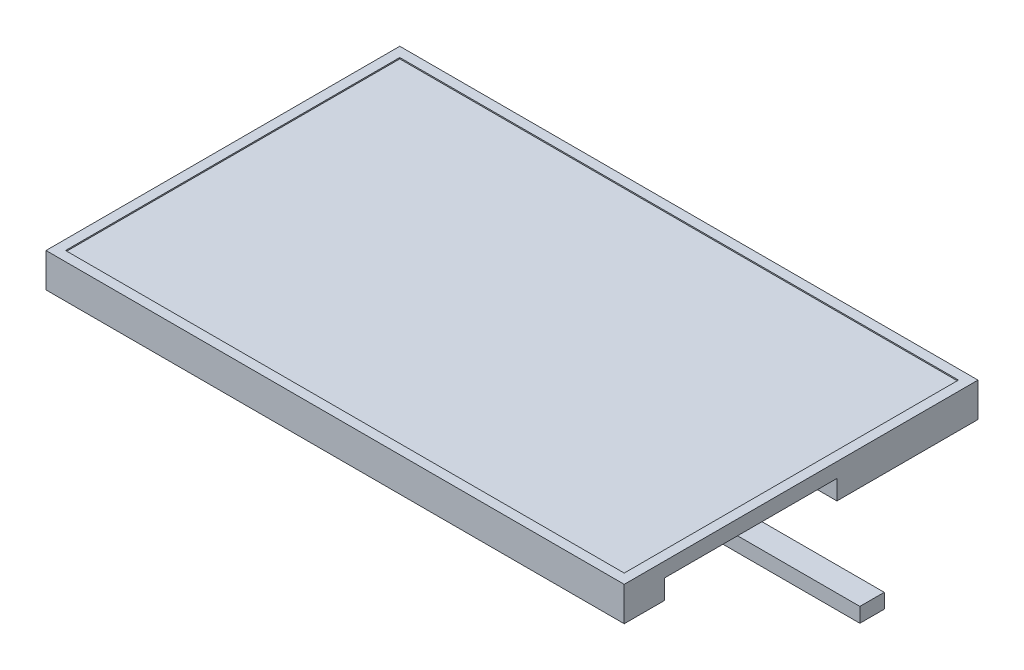
ISO-10303-21;
HEADER;
FILE_DESCRIPTION(('STEP AP214'),'2;1');
FILE_NAME('part.step','',(''),(''),'','','');
FILE_SCHEMA(('AUTOMOTIVE_DESIGN { 1 0 10303 214 1 1 1 1 }'));
ENDSEC;
DATA;
#1=APPLICATION_CONTEXT('core data for automotive mechanical design processes');
#2=APPLICATION_PROTOCOL_DEFINITION('international standard','automotive_design',2000,#1);
#3=PRODUCT_CONTEXT('',#1,'mechanical');
#4=PRODUCT('Part','Part','',(#3));
#5=PRODUCT_RELATED_PRODUCT_CATEGORY('part','',(#4));
#6=PRODUCT_DEFINITION_FORMATION('','',#4);
#7=PRODUCT_DEFINITION_CONTEXT('part definition',#1,'design');
#8=PRODUCT_DEFINITION('design','',#6,#7);
#9=PRODUCT_DEFINITION_SHAPE('','',#8);
#10=(LENGTH_UNIT() NAMED_UNIT(*) SI_UNIT(.MILLI.,.METRE.));
#11=(NAMED_UNIT(*) PLANE_ANGLE_UNIT() SI_UNIT($,.RADIAN.));
#12=(NAMED_UNIT(*) SI_UNIT($,.STERADIAN.) SOLID_ANGLE_UNIT());
#13=UNCERTAINTY_MEASURE_WITH_UNIT(LENGTH_MEASURE(1.E-05),#10,'distance_accuracy_value','');
#14=(GEOMETRIC_REPRESENTATION_CONTEXT(3) GLOBAL_UNCERTAINTY_ASSIGNED_CONTEXT((#13)) GLOBAL_UNIT_ASSIGNED_CONTEXT((#10,
#11,#12)) REPRESENTATION_CONTEXT('',''));
#15=CARTESIAN_POINT('',(0.,0.,0.));
#16=DIRECTION('',(0.,0.,1.));
#17=DIRECTION('',(1.,0.,0.));
#18=AXIS2_PLACEMENT_3D('',#15,#16,#17);
#19=CARTESIAN_POINT('',(86.6232743335084,8.,-87.1819107574992));
#20=DIRECTION('',(-1.,0.,0.));
#21=DIRECTION('',(0.,0.,1.));
#22=AXIS2_PLACEMENT_3D('',#19,#20,#21);
#23=PLANE('',#22);
#24=DIRECTION('',(0.,-1.,0.));
#25=VECTOR('',#24,1.);
#26=CARTESIAN_POINT('',(86.6232743335084,6.,-48.4583257592134));
#27=LINE('',#26,#25);
#28=CARTESIAN_POINT('',(86.6232743335084,6.,-48.4583257592134));
#29=VERTEX_POINT('',#28);
#30=CARTESIAN_POINT('',(86.6232743335084,0.,-48.4583257592134));
#31=VERTEX_POINT('',#30);
#32=EDGE_CURVE('E184',#29,#31,#27,.T.);
#33=ORIENTED_EDGE('',*,*,#32,.F.);
#34=DIRECTION('',(0.,0.,1.));
#35=VECTOR('',#34,1.);
#36=CARTESIAN_POINT('',(86.6232743335084,6.,-48.4583257592134));
#37=LINE('',#36,#35);
#38=CARTESIAN_POINT('',(86.6232743335084,6.,-58.4583257592134));
#39=VERTEX_POINT('',#38);
#40=EDGE_CURVE('E64',#39,#29,#37,.T.);
#41=ORIENTED_EDGE('',*,*,#40,.F.);
#42=DIRECTION('',(0.,1.,0.));
#43=VECTOR('',#42,1.);
#44=CARTESIAN_POINT('',(86.6232743335084,6.,-58.4583257592134));
#45=LINE('',#44,#43);
#46=CARTESIAN_POINT('',(86.6232743335084,0.,-58.4583257592134));
#47=VERTEX_POINT('',#46);
#48=EDGE_CURVE('E68',#47,#39,#45,.T.);
#49=ORIENTED_EDGE('',*,*,#48,.F.);
#50=DIRECTION('',(0.,0.,-1.));
#51=VECTOR('',#50,1.);
#52=CARTESIAN_POINT('',(86.6232743335084,0.,-87.1819107574992));
#53=LINE('',#52,#51);
#54=CARTESIAN_POINT('',(86.6232743335084,0.,-87.1819107574992));
#55=VERTEX_POINT('',#54);
#56=EDGE_CURVE('E239',#47,#55,#53,.T.);
#57=ORIENTED_EDGE('',*,*,#56,.T.);
#58=DIRECTION('',(0.,-1.,0.));
#59=VECTOR('',#58,1.);
#60=CARTESIAN_POINT('',(86.6232743335084,8.,-87.1819107574992));
#61=LINE('',#60,#59);
#62=CARTESIAN_POINT('',(86.6232743335084,8.,-87.1819107574992));
#63=VERTEX_POINT('',#62);
#64=EDGE_CURVE('E247',#63,#55,#61,.T.);
#65=ORIENTED_EDGE('',*,*,#64,.F.);
#66=DIRECTION('',(0.,0.,-1.));
#67=VECTOR('',#66,1.);
#68=CARTESIAN_POINT('',(86.6232743335084,8.,-87.1819107574992));
#69=LINE('',#68,#67);
#70=CARTESIAN_POINT('',(86.6232743335084,8.,-16.5110370150003));
#71=VERTEX_POINT('',#70);
#72=EDGE_CURVE('E230',#71,#63,#69,.T.);
#73=ORIENTED_EDGE('',*,*,#72,.F.);
#74=DIRECTION('',(0.,-1.,0.));
#75=VECTOR('',#74,1.);
#76=CARTESIAN_POINT('',(86.6232743335084,8.,-16.5110370150003));
#77=LINE('',#76,#75);
#78=CARTESIAN_POINT('',(86.6232743335084,0.,-16.5110370150003));
#79=VERTEX_POINT('',#78);
#80=EDGE_CURVE('E250',#71,#79,#77,.T.);
#81=ORIENTED_EDGE('',*,*,#80,.T.);
#82=EDGE_CURVE('E240',#79,#31,#53,.T.);
#83=ORIENTED_EDGE('',*,*,#82,.T.);
#84=EDGE_LOOP('',(#33,#41,#49,#57,#65,#73,#81,#83));
#85=FACE_BOUND('',#84,.T.);
#86=ADVANCED_FACE('F49',(#85),#23,.F.);
#87=CARTESIAN_POINT('',(-118.5,14.,-145.));
#88=DIRECTION('',(1.,0.,0.));
#89=DIRECTION('',(0.,0.,-1.));
#90=AXIS2_PLACEMENT_3D('',#87,#88,#89);
#91=PLANE('',#90);
#92=DIRECTION('',(0.,0.,1.));
#93=VECTOR('',#92,1.);
#94=CARTESIAN_POINT('',(-118.5,0.,-145.));
#95=LINE('',#94,#93);
#96=CARTESIAN_POINT('',(-118.5,0.,-145.));
#97=VERTEX_POINT('',#96);
#98=CARTESIAN_POINT('',(-118.5,0.,0.));
#99=VERTEX_POINT('',#98);
#100=EDGE_CURVE('E280',#97,#99,#95,.T.);
#101=ORIENTED_EDGE('',*,*,#100,.T.);
#102=DIRECTION('',(0.,-1.,0.));
#103=VECTOR('',#102,1.);
#104=CARTESIAN_POINT('',(-118.5,14.,0.));
#105=LINE('',#104,#103);
#106=CARTESIAN_POINT('',(-118.5,14.,0.));
#107=VERTEX_POINT('',#106);
#108=EDGE_CURVE('E11',#107,#99,#105,.T.);
#109=ORIENTED_EDGE('',*,*,#108,.F.);
#110=DIRECTION('',(0.,0.,1.));
#111=VECTOR('',#110,1.);
#112=CARTESIAN_POINT('',(-118.5,14.,-145.));
#113=LINE('',#112,#111);
#114=CARTESIAN_POINT('',(-118.5,14.,-145.));
#115=VERTEX_POINT('',#114);
#116=EDGE_CURVE('E283',#115,#107,#113,.T.);
#117=ORIENTED_EDGE('',*,*,#116,.F.);
#118=DIRECTION('',(0.,-1.,0.));
#119=VECTOR('',#118,1.);
#120=CARTESIAN_POINT('',(-118.5,14.,-145.));
#121=LINE('',#120,#119);
#122=EDGE_CURVE('E293',#115,#97,#121,.T.);
#123=ORIENTED_EDGE('',*,*,#122,.T.);
#124=EDGE_LOOP('',(#101,#109,#117,#123));
#125=FACE_BOUND('',#124,.T.);
#126=ADVANCED_FACE('F51',(#125),#91,.F.);
#127=CARTESIAN_POINT('',(-118.5,14.,0.));
#128=DIRECTION('',(0.,0.,-1.));
#129=DIRECTION('',(-1.,0.,0.));
#130=AXIS2_PLACEMENT_3D('',#127,#128,#129);
#131=PLANE('',#130);
#132=DIRECTION('',(1.,0.,0.));
#133=VECTOR('',#132,1.);
#134=CARTESIAN_POINT('',(-118.5,0.,0.));
#135=LINE('',#134,#133);
#136=CARTESIAN_POINT('',(118.5,0.,0.));
#137=VERTEX_POINT('',#136);
#138=EDGE_CURVE('E296',#99,#137,#135,.T.);
#139=ORIENTED_EDGE('',*,*,#138,.T.);
#140=DIRECTION('',(0.,-1.,0.));
#141=VECTOR('',#140,1.);
#142=CARTESIAN_POINT('',(118.5,14.,0.));
#143=LINE('',#142,#141);
#144=CARTESIAN_POINT('',(118.5,14.,0.));
#145=VERTEX_POINT('',#144);
#146=EDGE_CURVE('E57',#145,#137,#143,.T.);
#147=ORIENTED_EDGE('',*,*,#146,.F.);
#148=DIRECTION('',(1.,0.,0.));
#149=VECTOR('',#148,1.);
#150=CARTESIAN_POINT('',(-118.5,14.,0.));
#151=LINE('',#150,#149);
#152=EDGE_CURVE('E286',#107,#145,#151,.T.);
#153=ORIENTED_EDGE('',*,*,#152,.F.);
#154=ORIENTED_EDGE('',*,*,#108,.T.);
#155=EDGE_LOOP('',(#139,#147,#153,#154));
#156=FACE_BOUND('',#155,.T.);
#157=ADVANCED_FACE('F337',(#156),#131,.F.);
#158=CARTESIAN_POINT('',(118.5,14.,-145.));
#159=DIRECTION('',(-1.,0.,0.));
#160=DIRECTION('',(0.,0.,1.));
#161=AXIS2_PLACEMENT_3D('',#158,#159,#160);
#162=PLANE('',#161);
#163=DIRECTION('',(0.,0.,1.));
#164=VECTOR('',#163,1.);
#165=CARTESIAN_POINT('',(118.5,8.,-87.1819107574992));
#166=LINE('',#165,#164);
#167=CARTESIAN_POINT('',(118.5,8.,-87.1819107574992));
#168=VERTEX_POINT('',#167);
#169=CARTESIAN_POINT('',(118.5,8.,-16.5110370150003));
#170=VERTEX_POINT('',#169);
#171=EDGE_CURVE('E223',#168,#170,#166,.T.);
#172=ORIENTED_EDGE('',*,*,#171,.F.);
#173=DIRECTION('',(0.,-1.,0.));
#174=VECTOR('',#173,1.);
#175=CARTESIAN_POINT('',(118.5,8.,-87.1819107574992));
#176=LINE('',#175,#174);
#177=CARTESIAN_POINT('',(118.5,0.,-87.1819107574992));
#178=VERTEX_POINT('',#177);
#179=EDGE_CURVE('E243',#168,#178,#176,.T.);
#180=ORIENTED_EDGE('',*,*,#179,.T.);
#181=DIRECTION('',(0.,0.,-1.));
#182=VECTOR('',#181,1.);
#183=CARTESIAN_POINT('',(118.5,0.,-145.));
#184=LINE('',#183,#182);
#185=CARTESIAN_POINT('',(118.5,0.,-145.));
#186=VERTEX_POINT('',#185);
#187=EDGE_CURVE('E298',#178,#186,#184,.T.);
#188=ORIENTED_EDGE('',*,*,#187,.T.);
#189=DIRECTION('',(0.,-1.,0.));
#190=VECTOR('',#189,1.);
#191=CARTESIAN_POINT('',(118.5,14.,-145.));
#192=LINE('',#191,#190);
#193=CARTESIAN_POINT('',(118.5,14.,-145.));
#194=VERTEX_POINT('',#193);
#195=EDGE_CURVE('E305',#194,#186,#192,.T.);
#196=ORIENTED_EDGE('',*,*,#195,.F.);
#197=DIRECTION('',(0.,0.,-1.));
#198=VECTOR('',#197,1.);
#199=CARTESIAN_POINT('',(118.5,14.,-145.));
#200=LINE('',#199,#198);
#201=EDGE_CURVE('E289',#145,#194,#200,.T.);
#202=ORIENTED_EDGE('',*,*,#201,.F.);
#203=ORIENTED_EDGE('',*,*,#146,.T.);
#204=CARTESIAN_POINT('',(118.5,0.,-16.5110370150003));
#205=VERTEX_POINT('',#204);
#206=EDGE_CURVE('E299',#137,#205,#184,.T.);
#207=ORIENTED_EDGE('',*,*,#206,.T.);
#208=DIRECTION('',(0.,-1.,0.));
#209=VECTOR('',#208,1.);
#210=CARTESIAN_POINT('',(118.5,8.,-16.5110370150003));
#211=LINE('',#210,#209);
#212=EDGE_CURVE('E236',#170,#205,#211,.T.);
#213=ORIENTED_EDGE('',*,*,#212,.F.);
#214=EDGE_LOOP('',(#172,#180,#188,#196,#202,#203,#207,#213));
#215=FACE_BOUND('',#214,.T.);
#216=ADVANCED_FACE('F313',(#215),#162,.F.);
#217=CARTESIAN_POINT('',(-118.5,14.,-145.));
#218=DIRECTION('',(0.,0.,1.));
#219=DIRECTION('',(1.,0.,0.));
#220=AXIS2_PLACEMENT_3D('',#217,#218,#219);
#221=PLANE('',#220);
#222=DIRECTION('',(-1.,0.,0.));
#223=VECTOR('',#222,1.);
#224=CARTESIAN_POINT('',(-118.5,0.,-145.));
#225=LINE('',#224,#223);
#226=EDGE_CURVE('E287',#186,#97,#225,.T.);
#227=ORIENTED_EDGE('',*,*,#226,.T.);
#228=ORIENTED_EDGE('',*,*,#122,.F.);
#229=DIRECTION('',(-1.,0.,0.));
#230=VECTOR('',#229,1.);
#231=CARTESIAN_POINT('',(-118.5,14.,-145.));
#232=LINE('',#231,#230);
#233=EDGE_CURVE('E291',#194,#115,#232,.T.);
#234=ORIENTED_EDGE('',*,*,#233,.F.);
#235=ORIENTED_EDGE('',*,*,#195,.T.);
#236=EDGE_LOOP('',(#227,#228,#234,#235));
#237=FACE_BOUND('',#236,.T.);
#238=ADVANCED_FACE('F331',(#237),#221,.F.);
#239=CARTESIAN_POINT('',(0.,14.,0.));
#240=DIRECTION('',(0.,1.,0.));
#241=DIRECTION('',(0.,0.,1.));
#242=AXIS2_PLACEMENT_3D('',#239,#240,#241);
#243=PLANE('',#242);
#244=DIRECTION('',(-1.,0.,0.));
#245=VECTOR('',#244,1.);
#246=CARTESIAN_POINT('',(114.5,14.,-141.));
#247=LINE('',#246,#245);
#248=CARTESIAN_POINT('',(114.5,14.,-141.));
#249=VERTEX_POINT('',#248);
#250=CARTESIAN_POINT('',(-114.5,14.,-141.));
#251=VERTEX_POINT('',#250);
#252=EDGE_CURVE('E185',#249,#251,#247,.T.);
#253=ORIENTED_EDGE('',*,*,#252,.F.);
#254=DIRECTION('',(0.,0.,-1.));
#255=VECTOR('',#254,1.);
#256=CARTESIAN_POINT('',(114.5,14.,-4.00000000000004));
#257=LINE('',#256,#255);
#258=CARTESIAN_POINT('',(114.5,14.,-4.00000000000004));
#259=VERTEX_POINT('',#258);
#260=EDGE_CURVE('E197',#259,#249,#257,.T.);
#261=ORIENTED_EDGE('',*,*,#260,.F.);
#262=DIRECTION('',(1.,0.,0.));
#263=VECTOR('',#262,1.);
#264=CARTESIAN_POINT('',(-114.5,14.,-4.));
#265=LINE('',#264,#263);
#266=CARTESIAN_POINT('',(-114.5,14.,-4.));
#267=VERTEX_POINT('',#266);
#268=EDGE_CURVE('E209',#267,#259,#265,.T.);
#269=ORIENTED_EDGE('',*,*,#268,.F.);
#270=DIRECTION('',(0.,0.,1.));
#271=VECTOR('',#270,1.);
#272=CARTESIAN_POINT('',(-114.5,14.,-141.));
#273=LINE('',#272,#271);
#274=EDGE_CURVE('E187',#251,#267,#273,.T.);
#275=ORIENTED_EDGE('',*,*,#274,.F.);
#276=EDGE_LOOP('',(#253,#261,#269,#275));
#277=FACE_BOUND('',#276,.T.);
#278=ORIENTED_EDGE('',*,*,#116,.T.);
#279=ORIENTED_EDGE('',*,*,#152,.T.);
#280=ORIENTED_EDGE('',*,*,#201,.T.);
#281=ORIENTED_EDGE('',*,*,#233,.T.);
#282=EDGE_LOOP('',(#278,#279,#280,#281));
#283=FACE_BOUND('',#282,.T.);
#284=ADVANCED_FACE('F335',(#277,#283),#243,.T.);
#285=CARTESIAN_POINT('',(0.,0.,0.));
#286=DIRECTION('',(0.,1.,0.));
#287=DIRECTION('',(0.,0.,1.));
#288=AXIS2_PLACEMENT_3D('',#285,#286,#287);
#289=PLANE('',#288);
#290=CARTESIAN_POINT('',(0.,0.,-24.));
#291=DIRECTION('',(0.,-1.,0.));
#292=DIRECTION('',(0.,0.,-1.));
#293=AXIS2_PLACEMENT_3D('',#290,#291,#292);
#294=CIRCLE('',#293,3.);
#295=CARTESIAN_POINT('',(0.,0.,-27.));
#296=VERTEX_POINT('',#295);
#297=EDGE_CURVE('E272',#296,#296,#294,.T.);
#298=ORIENTED_EDGE('',*,*,#297,.F.);
#299=EDGE_LOOP('',(#298));
#300=FACE_BOUND('',#299,.T.);
#301=CARTESIAN_POINT('',(37.5,0.,-35.));
#302=DIRECTION('',(0.,-1.,0.));
#303=DIRECTION('',(0.,0.,-1.));
#304=AXIS2_PLACEMENT_3D('',#301,#302,#303);
#305=CIRCLE('',#304,2.);
#306=CARTESIAN_POINT('',(37.5,0.,-37.));
#307=VERTEX_POINT('',#306);
#308=EDGE_CURVE('E266',#307,#307,#305,.T.);
#309=ORIENTED_EDGE('',*,*,#308,.F.);
#310=EDGE_LOOP('',(#309));
#311=FACE_BOUND('',#310,.T.);
#312=CARTESIAN_POINT('',(-37.5,0.,-35.));
#313=DIRECTION('',(0.,-1.,0.));
#314=DIRECTION('',(0.,0.,-1.));
#315=AXIS2_PLACEMENT_3D('',#312,#313,#314);
#316=CIRCLE('',#315,2.);
#317=CARTESIAN_POINT('',(-37.5,0.,-37.));
#318=VERTEX_POINT('',#317);
#319=EDGE_CURVE('E260',#318,#318,#316,.T.);
#320=ORIENTED_EDGE('',*,*,#319,.F.);
#321=EDGE_LOOP('',(#320));
#322=FACE_BOUND('',#321,.T.);
#323=CARTESIAN_POINT('',(-37.5,0.,-110.));
#324=DIRECTION('',(0.,-1.,0.));
#325=DIRECTION('',(0.,0.,-1.));
#326=AXIS2_PLACEMENT_3D('',#323,#324,#325);
#327=CIRCLE('',#326,2.);
#328=CARTESIAN_POINT('',(-37.5,0.,-112.));
#329=VERTEX_POINT('',#328);
#330=EDGE_CURVE('E253',#329,#329,#327,.T.);
#331=ORIENTED_EDGE('',*,*,#330,.F.);
#332=EDGE_LOOP('',(#331));
#333=FACE_BOUND('',#332,.T.);
#334=CARTESIAN_POINT('',(37.5,0.,-110.));
#335=DIRECTION('',(0.,-1.,0.));
#336=DIRECTION('',(0.,0.,-1.));
#337=AXIS2_PLACEMENT_3D('',#334,#335,#336);
#338=CIRCLE('',#337,2.);
#339=CARTESIAN_POINT('',(37.5,0.,-112.));
#340=VERTEX_POINT('',#339);
#341=EDGE_CURVE('E256',#340,#340,#338,.T.);
#342=ORIENTED_EDGE('',*,*,#341,.F.);
#343=EDGE_LOOP('',(#342));
#344=FACE_BOUND('',#343,.T.);
#345=ORIENTED_EDGE('',*,*,#187,.F.);
#346=DIRECTION('',(1.,0.,0.));
#347=VECTOR('',#346,1.);
#348=CARTESIAN_POINT('',(118.5,0.,-87.1819107574992));
#349=LINE('',#348,#347);
#350=EDGE_CURVE('E227',#55,#178,#349,.T.);
#351=ORIENTED_EDGE('',*,*,#350,.F.);
#352=ORIENTED_EDGE('',*,*,#56,.F.);
#353=DIRECTION('',(-1.,0.,0.));
#354=VECTOR('',#353,1.);
#355=CARTESIAN_POINT('',(166.623274333508,0.,-58.4583257592134));
#356=LINE('',#355,#354);
#357=CARTESIAN_POINT('',(166.623274333508,0.,-58.4583257592134));
#358=VERTEX_POINT('',#357);
#359=EDGE_CURVE('E169',#358,#47,#356,.T.);
#360=ORIENTED_EDGE('',*,*,#359,.F.);
#361=DIRECTION('',(0.,0.,-1.));
#362=VECTOR('',#361,1.);
#363=CARTESIAN_POINT('',(166.623274333508,0.,-48.4583257592134));
#364=LINE('',#363,#362);
#365=CARTESIAN_POINT('',(166.623274333508,0.,-48.4583257592134));
#366=VERTEX_POINT('',#365);
#367=EDGE_CURVE('E160',#366,#358,#364,.T.);
#368=ORIENTED_EDGE('',*,*,#367,.F.);
#369=DIRECTION('',(-1.,0.,0.));
#370=VECTOR('',#369,1.);
#371=CARTESIAN_POINT('',(166.623274333508,0.,-48.4583257592134));
#372=LINE('',#371,#370);
#373=EDGE_CURVE('E166',#366,#31,#372,.T.);
#374=ORIENTED_EDGE('',*,*,#373,.T.);
#375=ORIENTED_EDGE('',*,*,#82,.F.);
#376=DIRECTION('',(-1.,0.,0.));
#377=VECTOR('',#376,1.);
#378=CARTESIAN_POINT('',(118.5,0.,-16.5110370150003));
#379=LINE('',#378,#377);
#380=EDGE_CURVE('E216',#205,#79,#379,.T.);
#381=ORIENTED_EDGE('',*,*,#380,.F.);
#382=ORIENTED_EDGE('',*,*,#206,.F.);
#383=ORIENTED_EDGE('',*,*,#138,.F.);
#384=ORIENTED_EDGE('',*,*,#100,.F.);
#385=ORIENTED_EDGE('',*,*,#226,.F.);
#386=EDGE_LOOP('',(#345,#351,#352,#360,#368,#374,#375,#381,#382,#383,#384,#385));
#387=FACE_BOUND('',#386,.T.);
#388=ADVANCED_FACE('F163',(#300,#311,#322,#333,#344,#387),#289,.F.);
#389=CARTESIAN_POINT('',(37.5,4.,-110.));
#390=DIRECTION('',(0.,-1.,0.));
#391=DIRECTION('',(0.,0.,-1.));
#392=AXIS2_PLACEMENT_3D('',#389,#390,#391);
#393=CYLINDRICAL_SURFACE('',#392,2.);
#394=CARTESIAN_POINT('',(37.5,4.,-110.));
#395=DIRECTION('',(0.,-1.,0.));
#396=DIRECTION('',(0.,0.,-1.));
#397=AXIS2_PLACEMENT_3D('',#394,#395,#396);
#398=CIRCLE('',#397,2.);
#399=CARTESIAN_POINT('',(37.5,4.,-112.));
#400=VERTEX_POINT('',#399);
#401=EDGE_CURVE('E277',#400,#400,#398,.T.);
#402=ORIENTED_EDGE('',*,*,#401,.F.);
#403=EDGE_LOOP('',(#402));
#404=FACE_BOUND('',#403,.T.);
#405=ORIENTED_EDGE('',*,*,#341,.T.);
#406=EDGE_LOOP('',(#405));
#407=FACE_BOUND('',#406,.T.);
#408=ADVANCED_FACE('F389',(#404,#407),#393,.F.);
#409=CARTESIAN_POINT('',(37.5,4.,-110.));
#410=DIRECTION('',(0.,-1.,0.));
#411=DIRECTION('',(0.,0.,-1.));
#412=AXIS2_PLACEMENT_3D('',#409,#410,#411);
#413=PLANE('',#412);
#414=ORIENTED_EDGE('',*,*,#401,.T.);
#415=EDGE_LOOP('',(#414));
#416=FACE_BOUND('',#415,.T.);
#417=ADVANCED_FACE('F358',(#416),#413,.T.);
#418=CARTESIAN_POINT('',(-37.5,4.,-110.));
#419=DIRECTION('',(0.,-1.,0.));
#420=DIRECTION('',(0.,0.,-1.));
#421=AXIS2_PLACEMENT_3D('',#418,#419,#420);
#422=CYLINDRICAL_SURFACE('',#421,2.);
#423=CARTESIAN_POINT('',(-37.5,4.,-110.));
#424=DIRECTION('',(0.,-1.,0.));
#425=DIRECTION('',(0.,0.,-1.));
#426=AXIS2_PLACEMENT_3D('',#423,#424,#425);
#427=CIRCLE('',#426,2.);
#428=CARTESIAN_POINT('',(-37.5,4.,-112.));
#429=VERTEX_POINT('',#428);
#430=EDGE_CURVE('E257',#429,#429,#427,.T.);
#431=ORIENTED_EDGE('',*,*,#430,.F.);
#432=EDGE_LOOP('',(#431));
#433=FACE_BOUND('',#432,.T.);
#434=ORIENTED_EDGE('',*,*,#330,.T.);
#435=EDGE_LOOP('',(#434));
#436=FACE_BOUND('',#435,.T.);
#437=ADVANCED_FACE('F354',(#433,#436),#422,.F.);
#438=CARTESIAN_POINT('',(-37.5,4.,-110.));
#439=DIRECTION('',(0.,-1.,0.));
#440=DIRECTION('',(0.,0.,-1.));
#441=AXIS2_PLACEMENT_3D('',#438,#439,#440);
#442=PLANE('',#441);
#443=ORIENTED_EDGE('',*,*,#430,.T.);
#444=EDGE_LOOP('',(#443));
#445=FACE_BOUND('',#444,.T.);
#446=ADVANCED_FACE('F357',(#445),#442,.T.);
#447=CARTESIAN_POINT('',(-37.5,4.,-35.));
#448=DIRECTION('',(0.,-1.,0.));
#449=DIRECTION('',(0.,0.,-1.));
#450=AXIS2_PLACEMENT_3D('',#447,#448,#449);
#451=CYLINDRICAL_SURFACE('',#450,2.);
#452=CARTESIAN_POINT('',(-37.5,4.,-35.));
#453=DIRECTION('',(0.,-1.,0.));
#454=DIRECTION('',(0.,0.,-1.));
#455=AXIS2_PLACEMENT_3D('',#452,#453,#454);
#456=CIRCLE('',#455,2.);
#457=CARTESIAN_POINT('',(-37.5,4.,-37.));
#458=VERTEX_POINT('',#457);
#459=EDGE_CURVE('E263',#458,#458,#456,.T.);
#460=ORIENTED_EDGE('',*,*,#459,.F.);
#461=EDGE_LOOP('',(#460));
#462=FACE_BOUND('',#461,.T.);
#463=ORIENTED_EDGE('',*,*,#319,.T.);
#464=EDGE_LOOP('',(#463));
#465=FACE_BOUND('',#464,.T.);
#466=ADVANCED_FACE('F362',(#462,#465),#451,.F.);
#467=CARTESIAN_POINT('',(-37.5,4.,-35.));
#468=DIRECTION('',(0.,-1.,0.));
#469=DIRECTION('',(0.,0.,-1.));
#470=AXIS2_PLACEMENT_3D('',#467,#468,#469);
#471=PLANE('',#470);
#472=ORIENTED_EDGE('',*,*,#459,.T.);
#473=EDGE_LOOP('',(#472));
#474=FACE_BOUND('',#473,.T.);
#475=ADVANCED_FACE('F366',(#474),#471,.T.);
#476=CARTESIAN_POINT('',(37.5,4.,-35.));
#477=DIRECTION('',(0.,-1.,0.));
#478=DIRECTION('',(0.,0.,-1.));
#479=AXIS2_PLACEMENT_3D('',#476,#477,#478);
#480=CYLINDRICAL_SURFACE('',#479,2.);
#481=CARTESIAN_POINT('',(37.5,4.,-35.));
#482=DIRECTION('',(0.,-1.,0.));
#483=DIRECTION('',(0.,0.,-1.));
#484=AXIS2_PLACEMENT_3D('',#481,#482,#483);
#485=CIRCLE('',#484,2.);
#486=CARTESIAN_POINT('',(37.5,4.,-37.));
#487=VERTEX_POINT('',#486);
#488=EDGE_CURVE('E269',#487,#487,#485,.T.);
#489=ORIENTED_EDGE('',*,*,#488,.F.);
#490=EDGE_LOOP('',(#489));
#491=FACE_BOUND('',#490,.T.);
#492=ORIENTED_EDGE('',*,*,#308,.T.);
#493=EDGE_LOOP('',(#492));
#494=FACE_BOUND('',#493,.T.);
#495=ADVANCED_FACE('F370',(#491,#494),#480,.F.);
#496=CARTESIAN_POINT('',(37.5,4.,-35.));
#497=DIRECTION('',(0.,-1.,0.));
#498=DIRECTION('',(0.,0.,-1.));
#499=AXIS2_PLACEMENT_3D('',#496,#497,#498);
#500=PLANE('',#499);
#501=ORIENTED_EDGE('',*,*,#488,.T.);
#502=EDGE_LOOP('',(#501));
#503=FACE_BOUND('',#502,.T.);
#504=ADVANCED_FACE('F374',(#503),#500,.T.);
#505=CARTESIAN_POINT('',(0.,4.,-24.));
#506=DIRECTION('',(0.,-1.,0.));
#507=DIRECTION('',(0.,0.,-1.));
#508=AXIS2_PLACEMENT_3D('',#505,#506,#507);
#509=CYLINDRICAL_SURFACE('',#508,3.);
#510=CARTESIAN_POINT('',(0.,4.,-24.));
#511=DIRECTION('',(0.,-1.,0.));
#512=DIRECTION('',(0.,0.,-1.));
#513=AXIS2_PLACEMENT_3D('',#510,#511,#512);
#514=CIRCLE('',#513,3.);
#515=CARTESIAN_POINT('',(0.,4.,-27.));
#516=VERTEX_POINT('',#515);
#517=EDGE_CURVE('E246',#516,#516,#514,.T.);
#518=ORIENTED_EDGE('',*,*,#517,.F.);
#519=EDGE_LOOP('',(#518));
#520=FACE_BOUND('',#519,.T.);
#521=ORIENTED_EDGE('',*,*,#297,.T.);
#522=EDGE_LOOP('',(#521));
#523=FACE_BOUND('',#522,.T.);
#524=ADVANCED_FACE('F378',(#520,#523),#509,.F.);
#525=CARTESIAN_POINT('',(0.,4.,-24.));
#526=DIRECTION('',(0.,-1.,0.));
#527=DIRECTION('',(0.,0.,-1.));
#528=AXIS2_PLACEMENT_3D('',#525,#526,#527);
#529=PLANE('',#528);
#530=ORIENTED_EDGE('',*,*,#517,.T.);
#531=EDGE_LOOP('',(#530));
#532=FACE_BOUND('',#531,.T.);
#533=ADVANCED_FACE('F382',(#532),#529,.T.);
#534=CARTESIAN_POINT('',(118.5,8.,-87.1819107574992));
#535=DIRECTION('',(0.,0.,-1.));
#536=DIRECTION('',(-1.,0.,0.));
#537=AXIS2_PLACEMENT_3D('',#534,#535,#536);
#538=PLANE('',#537);
#539=ORIENTED_EDGE('',*,*,#350,.T.);
#540=ORIENTED_EDGE('',*,*,#179,.F.);
#541=DIRECTION('',(1.,0.,0.));
#542=VECTOR('',#541,1.);
#543=CARTESIAN_POINT('',(118.5,8.,-87.1819107574992));
#544=LINE('',#543,#542);
#545=EDGE_CURVE('E233',#63,#168,#544,.T.);
#546=ORIENTED_EDGE('',*,*,#545,.F.);
#547=ORIENTED_EDGE('',*,*,#64,.T.);
#548=EDGE_LOOP('',(#539,#540,#546,#547));
#549=FACE_BOUND('',#548,.T.);
#550=ADVANCED_FACE('F326',(#549),#538,.F.);
#551=CARTESIAN_POINT('',(118.5,8.,-16.5110370150003));
#552=DIRECTION('',(0.,0.,1.));
#553=DIRECTION('',(1.,0.,0.));
#554=AXIS2_PLACEMENT_3D('',#551,#552,#553);
#555=PLANE('',#554);
#556=ORIENTED_EDGE('',*,*,#380,.T.);
#557=ORIENTED_EDGE('',*,*,#80,.F.);
#558=DIRECTION('',(-1.,0.,0.));
#559=VECTOR('',#558,1.);
#560=CARTESIAN_POINT('',(118.5,8.,-16.5110370150003));
#561=LINE('',#560,#559);
#562=EDGE_CURVE('E226',#170,#71,#561,.T.);
#563=ORIENTED_EDGE('',*,*,#562,.F.);
#564=ORIENTED_EDGE('',*,*,#212,.T.);
#565=EDGE_LOOP('',(#556,#557,#563,#564));
#566=FACE_BOUND('',#565,.T.);
#567=ADVANCED_FACE('F320',(#566),#555,.F.);
#568=CARTESIAN_POINT('',(0.,8.,0.));
#569=DIRECTION('',(0.,-1.,0.));
#570=DIRECTION('',(0.,0.,-1.));
#571=AXIS2_PLACEMENT_3D('',#568,#569,#570);
#572=PLANE('',#571);
#573=ORIENTED_EDGE('',*,*,#171,.T.);
#574=ORIENTED_EDGE('',*,*,#562,.T.);
#575=ORIENTED_EDGE('',*,*,#72,.T.);
#576=ORIENTED_EDGE('',*,*,#545,.T.);
#577=EDGE_LOOP('',(#573,#574,#575,#576));
#578=FACE_BOUND('',#577,.T.);
#579=ADVANCED_FACE('F323',(#578),#572,.T.);
#580=CARTESIAN_POINT('',(114.5,13.5,-141.));
#581=DIRECTION('',(0.,0.,-1.));
#582=DIRECTION('',(-1.,0.,0.));
#583=AXIS2_PLACEMENT_3D('',#580,#581,#582);
#584=PLANE('',#583);
#585=ORIENTED_EDGE('',*,*,#252,.T.);
#586=DIRECTION('',(0.,1.,0.));
#587=VECTOR('',#586,1.);
#588=CARTESIAN_POINT('',(-114.5,13.5,-141.));
#589=LINE('',#588,#587);
#590=CARTESIAN_POINT('',(-114.5,13.5,-141.));
#591=VERTEX_POINT('',#590);
#592=EDGE_CURVE('E205',#591,#251,#589,.T.);
#593=ORIENTED_EDGE('',*,*,#592,.F.);
#594=DIRECTION('',(-1.,0.,0.));
#595=VECTOR('',#594,1.);
#596=CARTESIAN_POINT('',(114.5,13.5,-141.));
#597=LINE('',#596,#595);
#598=CARTESIAN_POINT('',(114.5,13.5,-141.));
#599=VERTEX_POINT('',#598);
#600=EDGE_CURVE('E193',#599,#591,#597,.T.);
#601=ORIENTED_EDGE('',*,*,#600,.F.);
#602=DIRECTION('',(0.,1.,0.));
#603=VECTOR('',#602,1.);
#604=CARTESIAN_POINT('',(114.5,13.5,-141.));
#605=LINE('',#604,#603);
#606=EDGE_CURVE('E214',#599,#249,#605,.T.);
#607=ORIENTED_EDGE('',*,*,#606,.T.);
#608=EDGE_LOOP('',(#585,#593,#601,#607));
#609=FACE_BOUND('',#608,.T.);
#610=ADVANCED_FACE('F426',(#609),#584,.F.);
#611=CARTESIAN_POINT('',(114.5,13.5,-4.00000000000004));
#612=DIRECTION('',(1.,0.,0.));
#613=DIRECTION('',(0.,0.,-1.));
#614=AXIS2_PLACEMENT_3D('',#611,#612,#613);
#615=PLANE('',#614);
#616=ORIENTED_EDGE('',*,*,#260,.T.);
#617=ORIENTED_EDGE('',*,*,#606,.F.);
#618=DIRECTION('',(0.,0.,-1.));
#619=VECTOR('',#618,1.);
#620=CARTESIAN_POINT('',(114.5,13.5,-4.00000000000004));
#621=LINE('',#620,#619);
#622=CARTESIAN_POINT('',(114.5,13.5,-4.00000000000004));
#623=VERTEX_POINT('',#622);
#624=EDGE_CURVE('E203',#623,#599,#621,.T.);
#625=ORIENTED_EDGE('',*,*,#624,.F.);
#626=DIRECTION('',(0.,1.,0.));
#627=VECTOR('',#626,1.);
#628=CARTESIAN_POINT('',(114.5,13.5,-4.00000000000004));
#629=LINE('',#628,#627);
#630=EDGE_CURVE('E217',#623,#259,#629,.T.);
#631=ORIENTED_EDGE('',*,*,#630,.T.);
#632=EDGE_LOOP('',(#616,#617,#625,#631));
#633=FACE_BOUND('',#632,.T.);
#634=ADVANCED_FACE('F443',(#633),#615,.F.);
#635=CARTESIAN_POINT('',(-114.5,13.5,-4.));
#636=DIRECTION('',(0.,0.,1.));
#637=DIRECTION('',(1.,0.,0.));
#638=AXIS2_PLACEMENT_3D('',#635,#636,#637);
#639=PLANE('',#638);
#640=ORIENTED_EDGE('',*,*,#268,.T.);
#641=ORIENTED_EDGE('',*,*,#630,.F.);
#642=DIRECTION('',(1.,0.,0.));
#643=VECTOR('',#642,1.);
#644=CARTESIAN_POINT('',(-114.5,13.5,-4.));
#645=LINE('',#644,#643);
#646=CARTESIAN_POINT('',(-114.5,13.5,-4.));
#647=VERTEX_POINT('',#646);
#648=EDGE_CURVE('E200',#647,#623,#645,.T.);
#649=ORIENTED_EDGE('',*,*,#648,.F.);
#650=DIRECTION('',(0.,1.,0.));
#651=VECTOR('',#650,1.);
#652=CARTESIAN_POINT('',(-114.5,13.5,-4.));
#653=LINE('',#652,#651);
#654=EDGE_CURVE('E219',#647,#267,#653,.T.);
#655=ORIENTED_EDGE('',*,*,#654,.T.);
#656=EDGE_LOOP('',(#640,#641,#649,#655));
#657=FACE_BOUND('',#656,.T.);
#658=ADVANCED_FACE('F452',(#657),#639,.F.);
#659=CARTESIAN_POINT('',(-114.5,13.5,-141.));
#660=DIRECTION('',(-1.,0.,0.));
#661=DIRECTION('',(0.,0.,1.));
#662=AXIS2_PLACEMENT_3D('',#659,#660,#661);
#663=PLANE('',#662);
#664=ORIENTED_EDGE('',*,*,#274,.T.);
#665=ORIENTED_EDGE('',*,*,#654,.F.);
#666=DIRECTION('',(0.,0.,1.));
#667=VECTOR('',#666,1.);
#668=CARTESIAN_POINT('',(-114.5,13.5,-141.));
#669=LINE('',#668,#667);
#670=EDGE_CURVE('E196',#591,#647,#669,.T.);
#671=ORIENTED_EDGE('',*,*,#670,.F.);
#672=ORIENTED_EDGE('',*,*,#592,.T.);
#673=EDGE_LOOP('',(#664,#665,#671,#672));
#674=FACE_BOUND('',#673,.T.);
#675=ADVANCED_FACE('F461',(#674),#663,.F.);
#676=CARTESIAN_POINT('',(0.,13.5,0.));
#677=DIRECTION('',(0.,1.,0.));
#678=DIRECTION('',(0.,0.,1.));
#679=AXIS2_PLACEMENT_3D('',#676,#677,#678);
#680=PLANE('',#679);
#681=ORIENTED_EDGE('',*,*,#600,.T.);
#682=ORIENTED_EDGE('',*,*,#670,.T.);
#683=ORIENTED_EDGE('',*,*,#648,.T.);
#684=ORIENTED_EDGE('',*,*,#624,.T.);
#685=EDGE_LOOP('',(#681,#682,#683,#684));
#686=FACE_BOUND('',#685,.T.);
#687=ADVANCED_FACE('F469',(#686),#680,.T.);
#688=CARTESIAN_POINT('',(166.623274333508,6.,-48.4583257592134));
#689=DIRECTION('',(0.,0.,-1.));
#690=DIRECTION('',(-1.,0.,0.));
#691=AXIS2_PLACEMENT_3D('',#688,#689,#690);
#692=PLANE('',#691);
#693=ORIENTED_EDGE('',*,*,#32,.T.);
#694=ORIENTED_EDGE('',*,*,#373,.F.);
#695=DIRECTION('',(0.,-1.,0.));
#696=VECTOR('',#695,1.);
#697=CARTESIAN_POINT('',(166.623274333508,6.,-48.4583257592134));
#698=LINE('',#697,#696);
#699=CARTESIAN_POINT('',(166.623274333508,6.,-48.4583257592134));
#700=VERTEX_POINT('',#699);
#701=EDGE_CURVE('E173',#700,#366,#698,.T.);
#702=ORIENTED_EDGE('',*,*,#701,.F.);
#703=DIRECTION('',(-1.,0.,0.));
#704=VECTOR('',#703,1.);
#705=CARTESIAN_POINT('',(166.623274333508,6.,-48.4583257592134));
#706=LINE('',#705,#704);
#707=EDGE_CURVE('E532',#700,#29,#706,.T.);
#708=ORIENTED_EDGE('',*,*,#707,.T.);
#709=EDGE_LOOP('',(#693,#694,#702,#708));
#710=FACE_BOUND('',#709,.T.);
#711=ADVANCED_FACE('F183',(#710),#692,.F.);
#712=CARTESIAN_POINT('',(166.623274333508,6.,-58.4583257592134));
#713=DIRECTION('',(0.,0.,1.));
#714=DIRECTION('',(1.,0.,0.));
#715=AXIS2_PLACEMENT_3D('',#712,#713,#714);
#716=PLANE('',#715);
#717=ORIENTED_EDGE('',*,*,#48,.T.);
#718=DIRECTION('',(-1.,0.,0.));
#719=VECTOR('',#718,1.);
#720=CARTESIAN_POINT('',(166.623274333508,6.,-58.4583257592134));
#721=LINE('',#720,#719);
#722=CARTESIAN_POINT('',(166.623274333508,6.,-58.4583257592134));
#723=VERTEX_POINT('',#722);
#724=EDGE_CURVE('E189',#723,#39,#721,.T.);
#725=ORIENTED_EDGE('',*,*,#724,.F.);
#726=DIRECTION('',(0.,1.,0.));
#727=VECTOR('',#726,1.);
#728=CARTESIAN_POINT('',(166.623274333508,6.,-58.4583257592134));
#729=LINE('',#728,#727);
#730=EDGE_CURVE('E172',#358,#723,#729,.T.);
#731=ORIENTED_EDGE('',*,*,#730,.F.);
#732=ORIENTED_EDGE('',*,*,#359,.T.);
#733=EDGE_LOOP('',(#717,#725,#731,#732));
#734=FACE_BOUND('',#733,.T.);
#735=ADVANCED_FACE('F501',(#734),#716,.F.);
#736=CARTESIAN_POINT('',(166.623274333508,6.,-48.4583257592134));
#737=DIRECTION('',(0.,-1.,0.));
#738=DIRECTION('',(0.,0.,-1.));
#739=AXIS2_PLACEMENT_3D('',#736,#737,#738);
#740=PLANE('',#739);
#741=ORIENTED_EDGE('',*,*,#40,.T.);
#742=ORIENTED_EDGE('',*,*,#707,.F.);
#743=DIRECTION('',(0.,0.,1.));
#744=VECTOR('',#743,1.);
#745=CARTESIAN_POINT('',(166.623274333508,6.,-48.4583257592134));
#746=LINE('',#745,#744);
#747=EDGE_CURVE('E178',#723,#700,#746,.T.);
#748=ORIENTED_EDGE('',*,*,#747,.F.);
#749=ORIENTED_EDGE('',*,*,#724,.T.);
#750=EDGE_LOOP('',(#741,#742,#748,#749));
#751=FACE_BOUND('',#750,.T.);
#752=ADVANCED_FACE('F510',(#751),#740,.F.);
#753=CARTESIAN_POINT('',(166.623274333508,0.,0.));
#754=DIRECTION('',(1.,0.,0.));
#755=DIRECTION('',(0.,0.,-1.));
#756=AXIS2_PLACEMENT_3D('',#753,#754,#755);
#757=PLANE('',#756);
#758=ORIENTED_EDGE('',*,*,#701,.T.);
#759=ORIENTED_EDGE('',*,*,#367,.T.);
#760=ORIENTED_EDGE('',*,*,#730,.T.);
#761=ORIENTED_EDGE('',*,*,#747,.T.);
#762=EDGE_LOOP('',(#758,#759,#760,#761));
#763=FACE_BOUND('',#762,.T.);
#764=ADVANCED_FACE('F176',(#763),#757,.T.);
#765=CLOSED_SHELL('',(#86,#126,#157,#216,#238,#284,#388,#408,#417,#437,#446,#466,#475,#495,#504,
#524,#533,#550,#567,#579,#610,#634,#658,#675,#687,#711,#735,#752,#764));
#766=MANIFOLD_SOLID_BREP('B2',#765);
#767=ADVANCED_BREP_SHAPE_REPRESENTATION('',(#18,#766),#14);
#768=SHAPE_DEFINITION_REPRESENTATION(#9,#767);
ENDSEC;
END-ISO-10303-21;
